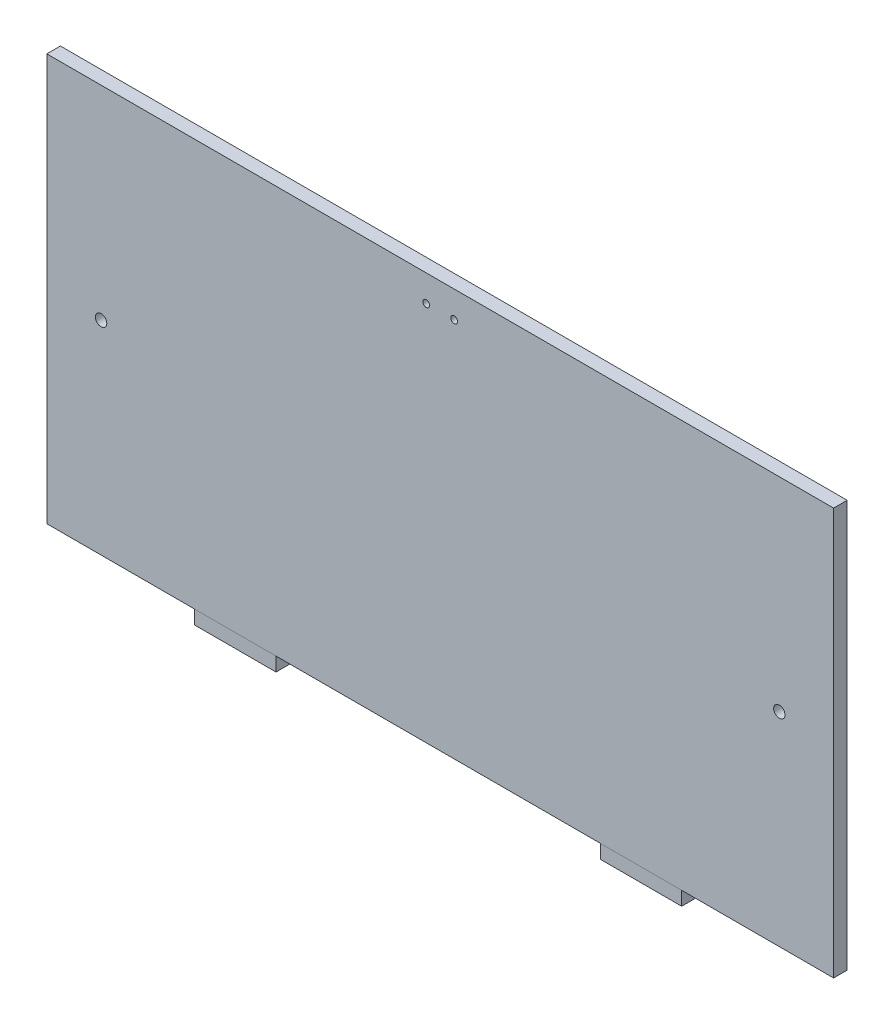
ISO-10303-21;
HEADER;
FILE_DESCRIPTION(('STEP AP214'),'2;1');
FILE_NAME('part.step','',(''),(''),'','','');
FILE_SCHEMA(('AUTOMOTIVE_DESIGN { 1 0 10303 214 1 1 1 1 }'));
ENDSEC;
DATA;
#1=APPLICATION_CONTEXT('core data for automotive mechanical design processes');
#2=APPLICATION_PROTOCOL_DEFINITION('international standard','automotive_design',2000,#1);
#3=PRODUCT_CONTEXT('',#1,'mechanical');
#4=PRODUCT('Part','Part','',(#3));
#5=PRODUCT_RELATED_PRODUCT_CATEGORY('part','',(#4));
#6=PRODUCT_DEFINITION_FORMATION('','',#4);
#7=PRODUCT_DEFINITION_CONTEXT('part definition',#1,'design');
#8=PRODUCT_DEFINITION('design','',#6,#7);
#9=PRODUCT_DEFINITION_SHAPE('','',#8);
#10=(LENGTH_UNIT() NAMED_UNIT(*) SI_UNIT(.MILLI.,.METRE.));
#11=(NAMED_UNIT(*) PLANE_ANGLE_UNIT() SI_UNIT($,.RADIAN.));
#12=(NAMED_UNIT(*) SI_UNIT($,.STERADIAN.) SOLID_ANGLE_UNIT());
#13=UNCERTAINTY_MEASURE_WITH_UNIT(LENGTH_MEASURE(1.E-05),#10,'distance_accuracy_value','');
#14=(GEOMETRIC_REPRESENTATION_CONTEXT(3) GLOBAL_UNCERTAINTY_ASSIGNED_CONTEXT((#13)) GLOBAL_UNIT_ASSIGNED_CONTEXT((#10,
#11,#12)) REPRESENTATION_CONTEXT('',''));
#15=CARTESIAN_POINT('',(0.,0.,0.));
#16=DIRECTION('',(0.,0.,1.));
#17=DIRECTION('',(1.,0.,0.));
#18=AXIS2_PLACEMENT_3D('',#15,#16,#17);
#19=CARTESIAN_POINT('',(0.,0.,5.));
#20=DIRECTION('',(0.,0.,1.));
#21=DIRECTION('',(1.,0.,0.));
#22=AXIS2_PLACEMENT_3D('',#19,#20,#21);
#23=PLANE('',#22);
#24=DIRECTION('',(1.,0.,0.));
#25=VECTOR('',#24,1.);
#26=CARTESIAN_POINT('',(0.,-80.1,5.));
#27=LINE('',#26,#25);
#28=CARTESIAN_POINT('',(-90.52,-80.1,5.));
#29=VERTEX_POINT('',#28);
#30=CARTESIAN_POINT('',(-60.52,-80.1,5.));
#31=VERTEX_POINT('',#30);
#32=EDGE_CURVE('E160',#29,#31,#27,.T.);
#33=ORIENTED_EDGE('',*,*,#32,.T.);
#34=DIRECTION('',(0.,-1.,0.));
#35=VECTOR('',#34,1.);
#36=CARTESIAN_POINT('',(-60.52,-69.9,5.));
#37=LINE('',#36,#35);
#38=CARTESIAN_POINT('',(-60.52,-69.9,5.));
#39=VERTEX_POINT('',#38);
#40=EDGE_CURVE('E112',#39,#31,#37,.T.);
#41=ORIENTED_EDGE('',*,*,#40,.F.);
#42=DIRECTION('',(1.,0.,0.));
#43=VECTOR('',#42,1.);
#44=CARTESIAN_POINT('',(-90.52,-69.9,5.));
#45=LINE('',#44,#43);
#46=CARTESIAN_POINT('',(-90.52,-69.9,5.));
#47=VERTEX_POINT('',#46);
#48=EDGE_CURVE('E13',#47,#39,#45,.T.);
#49=ORIENTED_EDGE('',*,*,#48,.F.);
#50=DIRECTION('',(0.,-1.,0.));
#51=VECTOR('',#50,1.);
#52=CARTESIAN_POINT('',(-90.52,-69.9,5.));
#53=LINE('',#52,#51);
#54=EDGE_CURVE('E176',#47,#29,#53,.T.);
#55=ORIENTED_EDGE('',*,*,#54,.T.);
#56=EDGE_LOOP('',(#33,#41,#49,#55));
#57=FACE_BOUND('',#56,.T.);
#58=ADVANCED_FACE('F101',(#57),#23,.T.);
#59=CARTESIAN_POINT('',(-60.52,0.,0.));
#60=DIRECTION('',(-1.,0.,0.));
#61=DIRECTION('',(0.,0.,1.));
#62=AXIS2_PLACEMENT_3D('',#59,#60,#61);
#63=PLANE('',#62);
#64=ORIENTED_EDGE('',*,*,#40,.T.);
#65=DIRECTION('',(0.,0.,1.));
#66=VECTOR('',#65,1.);
#67=CARTESIAN_POINT('',(-60.52,-80.1,0.));
#68=LINE('',#67,#66);
#69=CARTESIAN_POINT('',(-60.52,-80.1,0.));
#70=VERTEX_POINT('',#69);
#71=EDGE_CURVE('E162',#70,#31,#68,.T.);
#72=ORIENTED_EDGE('',*,*,#71,.F.);
#73=DIRECTION('',(0.,-1.,0.));
#74=VECTOR('',#73,1.);
#75=CARTESIAN_POINT('',(-60.52,-69.9,0.));
#76=LINE('',#75,#74);
#77=CARTESIAN_POINT('',(-60.52,-69.9,0.));
#78=VERTEX_POINT('',#77);
#79=EDGE_CURVE('E140',#78,#70,#76,.T.);
#80=ORIENTED_EDGE('',*,*,#79,.F.);
#81=DIRECTION('',(0.,0.,1.));
#82=VECTOR('',#81,1.);
#83=CARTESIAN_POINT('',(-60.52,-69.9,0.));
#84=LINE('',#83,#82);
#85=EDGE_CURVE('E168',#78,#39,#84,.T.);
#86=ORIENTED_EDGE('',*,*,#85,.T.);
#87=EDGE_LOOP('',(#64,#72,#80,#86));
#88=FACE_BOUND('',#87,.T.);
#89=ADVANCED_FACE('F187',(#88),#63,.F.);
#90=CARTESIAN_POINT('',(-90.52,0.,0.));
#91=DIRECTION('',(-1.,0.,0.));
#92=DIRECTION('',(0.,0.,1.));
#93=AXIS2_PLACEMENT_3D('',#90,#91,#92);
#94=PLANE('',#93);
#95=DIRECTION('',(0.,0.,1.));
#96=VECTOR('',#95,1.);
#97=CARTESIAN_POINT('',(-90.52,-80.1,0.));
#98=LINE('',#97,#96);
#99=CARTESIAN_POINT('',(-90.52,-80.1,0.));
#100=VERTEX_POINT('',#99);
#101=EDGE_CURVE('E150',#100,#29,#98,.T.);
#102=ORIENTED_EDGE('',*,*,#101,.T.);
#103=ORIENTED_EDGE('',*,*,#54,.F.);
#104=DIRECTION('',(0.,0.,1.));
#105=VECTOR('',#104,1.);
#106=CARTESIAN_POINT('',(-90.52,-69.9,0.));
#107=LINE('',#106,#105);
#108=CARTESIAN_POINT('',(-90.52,-69.9,0.));
#109=VERTEX_POINT('',#108);
#110=EDGE_CURVE('E152',#109,#47,#107,.T.);
#111=ORIENTED_EDGE('',*,*,#110,.F.);
#112=DIRECTION('',(0.,-1.,0.));
#113=VECTOR('',#112,1.);
#114=CARTESIAN_POINT('',(-90.52,-69.9,0.));
#115=LINE('',#114,#113);
#116=EDGE_CURVE('E146',#109,#100,#115,.T.);
#117=ORIENTED_EDGE('',*,*,#116,.T.);
#118=EDGE_LOOP('',(#102,#103,#111,#117));
#119=FACE_BOUND('',#118,.T.);
#120=ADVANCED_FACE('F148',(#119),#94,.T.);
#121=CARTESIAN_POINT('',(0.,-80.1,0.));
#122=DIRECTION('',(0.,-1.,0.));
#123=DIRECTION('',(0.,0.,-1.));
#124=AXIS2_PLACEMENT_3D('',#121,#122,#123);
#125=PLANE('',#124);
#126=ORIENTED_EDGE('',*,*,#32,.F.);
#127=ORIENTED_EDGE('',*,*,#101,.F.);
#128=DIRECTION('',(1.,0.,0.));
#129=VECTOR('',#128,1.);
#130=CARTESIAN_POINT('',(0.,-80.1,0.));
#131=LINE('',#130,#129);
#132=EDGE_CURVE('E105',#100,#70,#131,.T.);
#133=ORIENTED_EDGE('',*,*,#132,.T.);
#134=ORIENTED_EDGE('',*,*,#71,.T.);
#135=EDGE_LOOP('',(#126,#127,#133,#134));
#136=FACE_BOUND('',#135,.T.);
#137=ADVANCED_FACE('F158',(#136),#125,.T.);
#138=CARTESIAN_POINT('',(0.,0.,0.));
#139=DIRECTION('',(0.,0.,1.));
#140=DIRECTION('',(1.,0.,0.));
#141=AXIS2_PLACEMENT_3D('',#138,#139,#140);
#142=PLANE('',#141);
#143=ORIENTED_EDGE('',*,*,#79,.T.);
#144=ORIENTED_EDGE('',*,*,#132,.F.);
#145=ORIENTED_EDGE('',*,*,#116,.F.);
#146=DIRECTION('',(1.,0.,0.));
#147=VECTOR('',#146,1.);
#148=CARTESIAN_POINT('',(-90.52,-69.9,0.));
#149=LINE('',#148,#147);
#150=EDGE_CURVE('E173',#109,#78,#149,.T.);
#151=ORIENTED_EDGE('',*,*,#150,.T.);
#152=EDGE_LOOP('',(#143,#144,#145,#151));
#153=FACE_BOUND('',#152,.T.);
#154=ADVANCED_FACE('F103',(#153),#142,.F.);
#155=CARTESIAN_POINT('',(-90.52,-69.9,0.));
#156=DIRECTION('',(0.,-1.,0.));
#157=DIRECTION('',(0.,0.,-1.));
#158=AXIS2_PLACEMENT_3D('',#155,#156,#157);
#159=PLANE('',#158);
#160=ORIENTED_EDGE('',*,*,#48,.T.);
#161=ORIENTED_EDGE('',*,*,#85,.F.);
#162=ORIENTED_EDGE('',*,*,#150,.F.);
#163=ORIENTED_EDGE('',*,*,#110,.T.);
#164=EDGE_LOOP('',(#160,#161,#162,#163));
#165=FACE_BOUND('',#164,.T.);
#166=ADVANCED_FACE('F184',(#165),#159,.F.);
#167=CLOSED_SHELL('',(#58,#89,#120,#137,#154,#166));
#168=MANIFOLD_SOLID_BREP('B2',#167);
#169=CARTESIAN_POINT('',(0.,0.,5.));
#170=DIRECTION('',(0.,0.,1.));
#171=DIRECTION('',(1.,0.,0.));
#172=AXIS2_PLACEMENT_3D('',#169,#170,#171);
#173=PLANE('',#172);
#174=DIRECTION('',(0.,-1.,0.));
#175=VECTOR('',#174,1.);
#176=CARTESIAN_POINT('',(89.,0.,5.));
#177=LINE('',#176,#175);
#178=CARTESIAN_POINT('',(89.,-69.9,5.));
#179=VERTEX_POINT('',#178);
#180=CARTESIAN_POINT('',(89.,-80.1,5.));
#181=VERTEX_POINT('',#180);
#182=EDGE_CURVE('E306',#179,#181,#177,.T.);
#183=ORIENTED_EDGE('',*,*,#182,.F.);
#184=DIRECTION('',(1.,0.,0.));
#185=VECTOR('',#184,1.);
#186=CARTESIAN_POINT('',(59.,-69.9,5.));
#187=LINE('',#186,#185);
#188=CARTESIAN_POINT('',(59.,-69.9,5.));
#189=VERTEX_POINT('',#188);
#190=EDGE_CURVE('E325',#189,#179,#187,.T.);
#191=ORIENTED_EDGE('',*,*,#190,.F.);
#192=DIRECTION('',(0.,-1.,0.));
#193=VECTOR('',#192,1.);
#194=CARTESIAN_POINT('',(59.,0.,5.));
#195=LINE('',#194,#193);
#196=CARTESIAN_POINT('',(59.,-80.1,5.));
#197=VERTEX_POINT('',#196);
#198=EDGE_CURVE('E312',#189,#197,#195,.T.);
#199=ORIENTED_EDGE('',*,*,#198,.T.);
#200=DIRECTION('',(1.,0.,0.));
#201=VECTOR('',#200,1.);
#202=CARTESIAN_POINT('',(0.,-80.1,5.));
#203=LINE('',#202,#201);
#204=EDGE_CURVE('E320',#197,#181,#203,.T.);
#205=ORIENTED_EDGE('',*,*,#204,.T.);
#206=EDGE_LOOP('',(#183,#191,#199,#205));
#207=FACE_BOUND('',#206,.T.);
#208=ADVANCED_FACE('F266',(#207),#173,.T.);
#209=CARTESIAN_POINT('',(89.,0.,0.));
#210=DIRECTION('',(-1.,0.,0.));
#211=DIRECTION('',(0.,0.,1.));
#212=AXIS2_PLACEMENT_3D('',#209,#210,#211);
#213=PLANE('',#212);
#214=ORIENTED_EDGE('',*,*,#182,.T.);
#215=DIRECTION('',(0.,0.,1.));
#216=VECTOR('',#215,1.);
#217=CARTESIAN_POINT('',(89.,-80.1,0.));
#218=LINE('',#217,#216);
#219=CARTESIAN_POINT('',(89.,-80.1,0.));
#220=VERTEX_POINT('',#219);
#221=EDGE_CURVE('E99',#220,#181,#218,.T.);
#222=ORIENTED_EDGE('',*,*,#221,.F.);
#223=DIRECTION('',(0.,-1.,0.));
#224=VECTOR('',#223,1.);
#225=CARTESIAN_POINT('',(89.,0.,0.));
#226=LINE('',#225,#224);
#227=CARTESIAN_POINT('',(89.,-69.9,0.));
#228=VERTEX_POINT('',#227);
#229=EDGE_CURVE('E286',#228,#220,#226,.T.);
#230=ORIENTED_EDGE('',*,*,#229,.F.);
#231=DIRECTION('',(0.,0.,1.));
#232=VECTOR('',#231,1.);
#233=CARTESIAN_POINT('',(89.,-69.9,0.));
#234=LINE('',#233,#232);
#235=EDGE_CURVE('E270',#228,#179,#234,.T.);
#236=ORIENTED_EDGE('',*,*,#235,.T.);
#237=EDGE_LOOP('',(#214,#222,#230,#236));
#238=FACE_BOUND('',#237,.T.);
#239=ADVANCED_FACE('F349',(#238),#213,.F.);
#240=CARTESIAN_POINT('',(59.,0.,0.));
#241=DIRECTION('',(-1.,0.,0.));
#242=DIRECTION('',(0.,0.,1.));
#243=AXIS2_PLACEMENT_3D('',#240,#241,#242);
#244=PLANE('',#243);
#245=ORIENTED_EDGE('',*,*,#198,.F.);
#246=DIRECTION('',(0.,0.,1.));
#247=VECTOR('',#246,1.);
#248=CARTESIAN_POINT('',(59.,-69.9,0.));
#249=LINE('',#248,#247);
#250=CARTESIAN_POINT('',(59.,-69.9,0.));
#251=VERTEX_POINT('',#250);
#252=EDGE_CURVE('E316',#251,#189,#249,.T.);
#253=ORIENTED_EDGE('',*,*,#252,.F.);
#254=DIRECTION('',(0.,-1.,0.));
#255=VECTOR('',#254,1.);
#256=CARTESIAN_POINT('',(59.,0.,0.));
#257=LINE('',#256,#255);
#258=CARTESIAN_POINT('',(59.,-80.1,0.));
#259=VERTEX_POINT('',#258);
#260=EDGE_CURVE('E344',#251,#259,#257,.T.);
#261=ORIENTED_EDGE('',*,*,#260,.T.);
#262=DIRECTION('',(0.,0.,1.));
#263=VECTOR('',#262,1.);
#264=CARTESIAN_POINT('',(59.,-80.1,0.));
#265=LINE('',#264,#263);
#266=EDGE_CURVE('E277',#259,#197,#265,.T.);
#267=ORIENTED_EDGE('',*,*,#266,.T.);
#268=EDGE_LOOP('',(#245,#253,#261,#267));
#269=FACE_BOUND('',#268,.T.);
#270=ADVANCED_FACE('F314',(#269),#244,.T.);
#271=CARTESIAN_POINT('',(0.,-80.1,0.));
#272=DIRECTION('',(0.,-1.,0.));
#273=DIRECTION('',(0.,0.,-1.));
#274=AXIS2_PLACEMENT_3D('',#271,#272,#273);
#275=PLANE('',#274);
#276=ORIENTED_EDGE('',*,*,#204,.F.);
#277=ORIENTED_EDGE('',*,*,#266,.F.);
#278=DIRECTION('',(1.,0.,0.));
#279=VECTOR('',#278,1.);
#280=CARTESIAN_POINT('',(0.,-80.1,0.));
#281=LINE('',#280,#279);
#282=EDGE_CURVE('E335',#259,#220,#281,.T.);
#283=ORIENTED_EDGE('',*,*,#282,.T.);
#284=ORIENTED_EDGE('',*,*,#221,.T.);
#285=EDGE_LOOP('',(#276,#277,#283,#284));
#286=FACE_BOUND('',#285,.T.);
#287=ADVANCED_FACE('F352',(#286),#275,.T.);
#288=CARTESIAN_POINT('',(0.,0.,0.));
#289=DIRECTION('',(0.,0.,1.));
#290=DIRECTION('',(1.,0.,0.));
#291=AXIS2_PLACEMENT_3D('',#288,#289,#290);
#292=PLANE('',#291);
#293=ORIENTED_EDGE('',*,*,#229,.T.);
#294=ORIENTED_EDGE('',*,*,#282,.F.);
#295=ORIENTED_EDGE('',*,*,#260,.F.);
#296=DIRECTION('',(1.,0.,0.));
#297=VECTOR('',#296,1.);
#298=CARTESIAN_POINT('',(59.,-69.9,0.));
#299=LINE('',#298,#297);
#300=EDGE_CURVE('E326',#251,#228,#299,.T.);
#301=ORIENTED_EDGE('',*,*,#300,.T.);
#302=EDGE_LOOP('',(#293,#294,#295,#301));
#303=FACE_BOUND('',#302,.T.);
#304=ADVANCED_FACE('F350',(#303),#292,.F.);
#305=CARTESIAN_POINT('',(59.,-69.9,0.));
#306=DIRECTION('',(0.,-1.,0.));
#307=DIRECTION('',(0.,0.,-1.));
#308=AXIS2_PLACEMENT_3D('',#305,#306,#307);
#309=PLANE('',#308);
#310=ORIENTED_EDGE('',*,*,#190,.T.);
#311=ORIENTED_EDGE('',*,*,#235,.F.);
#312=ORIENTED_EDGE('',*,*,#300,.F.);
#313=ORIENTED_EDGE('',*,*,#252,.T.);
#314=EDGE_LOOP('',(#310,#311,#312,#313));
#315=FACE_BOUND('',#314,.T.);
#316=ADVANCED_FACE('F268',(#315),#309,.F.);
#317=CLOSED_SHELL('',(#208,#239,#270,#287,#304,#316));
#318=MANIFOLD_SOLID_BREP('B7',#317);
#319=CARTESIAN_POINT('',(145.,75.,5.));
#320=DIRECTION('',(-1.,0.,0.));
#321=DIRECTION('',(0.,-1.,0.));
#322=AXIS2_PLACEMENT_3D('',#319,#320,#321);
#323=PLANE('',#322);
#324=DIRECTION('',(0.,1.,0.));
#325=VECTOR('',#324,1.);
#326=CARTESIAN_POINT('',(145.,75.,0.));
#327=LINE('',#326,#325);
#328=CARTESIAN_POINT('',(145.,-75.,0.));
#329=VERTEX_POINT('',#328);
#330=CARTESIAN_POINT('',(145.,75.,0.));
#331=VERTEX_POINT('',#330);
#332=EDGE_CURVE('E491',#329,#331,#327,.T.);
#333=ORIENTED_EDGE('',*,*,#332,.T.);
#334=DIRECTION('',(0.,0.,-1.));
#335=VECTOR('',#334,1.);
#336=CARTESIAN_POINT('',(145.,75.,5.));
#337=LINE('',#336,#335);
#338=CARTESIAN_POINT('',(145.,75.,5.));
#339=VERTEX_POINT('',#338);
#340=EDGE_CURVE('E264',#339,#331,#337,.T.);
#341=ORIENTED_EDGE('',*,*,#340,.F.);
#342=DIRECTION('',(0.,1.,0.));
#343=VECTOR('',#342,1.);
#344=CARTESIAN_POINT('',(145.,75.,5.));
#345=LINE('',#344,#343);
#346=CARTESIAN_POINT('',(145.,-75.,5.));
#347=VERTEX_POINT('',#346);
#348=EDGE_CURVE('E474',#347,#339,#345,.T.);
#349=ORIENTED_EDGE('',*,*,#348,.F.);
#350=DIRECTION('',(0.,0.,-1.));
#351=VECTOR('',#350,1.);
#352=CARTESIAN_POINT('',(145.,-75.,5.));
#353=LINE('',#352,#351);
#354=EDGE_CURVE('E487',#347,#329,#353,.T.);
#355=ORIENTED_EDGE('',*,*,#354,.T.);
#356=EDGE_LOOP('',(#333,#341,#349,#355));
#357=FACE_BOUND('',#356,.T.);
#358=ADVANCED_FACE('F422',(#357),#323,.F.);
#359=CARTESIAN_POINT('',(-145.,75.,5.));
#360=DIRECTION('',(0.,-1.,0.));
#361=DIRECTION('',(0.,0.,-1.));
#362=AXIS2_PLACEMENT_3D('',#359,#360,#361);
#363=PLANE('',#362);
#364=DIRECTION('',(-1.,0.,0.));
#365=VECTOR('',#364,1.);
#366=CARTESIAN_POINT('',(-145.,75.,0.));
#367=LINE('',#366,#365);
#368=CARTESIAN_POINT('',(-145.,75.,0.));
#369=VERTEX_POINT('',#368);
#370=EDGE_CURVE('E479',#331,#369,#367,.T.);
#371=ORIENTED_EDGE('',*,*,#370,.T.);
#372=DIRECTION('',(0.,0.,-1.));
#373=VECTOR('',#372,1.);
#374=CARTESIAN_POINT('',(-145.,75.,5.));
#375=LINE('',#374,#373);
#376=CARTESIAN_POINT('',(-145.,75.,5.));
#377=VERTEX_POINT('',#376);
#378=EDGE_CURVE('E431',#377,#369,#375,.T.);
#379=ORIENTED_EDGE('',*,*,#378,.F.);
#380=DIRECTION('',(-1.,0.,0.));
#381=VECTOR('',#380,1.);
#382=CARTESIAN_POINT('',(-145.,75.,5.));
#383=LINE('',#382,#381);
#384=EDGE_CURVE('E469',#339,#377,#383,.T.);
#385=ORIENTED_EDGE('',*,*,#384,.F.);
#386=ORIENTED_EDGE('',*,*,#340,.T.);
#387=EDGE_LOOP('',(#371,#379,#385,#386));
#388=FACE_BOUND('',#387,.T.);
#389=ADVANCED_FACE('F478',(#388),#363,.F.);
#390=CARTESIAN_POINT('',(-145.,75.,5.));
#391=DIRECTION('',(1.,0.,0.));
#392=DIRECTION('',(0.,1.,0.));
#393=AXIS2_PLACEMENT_3D('',#390,#391,#392);
#394=PLANE('',#393);
#395=DIRECTION('',(0.,-1.,0.));
#396=VECTOR('',#395,1.);
#397=CARTESIAN_POINT('',(-145.,75.,0.));
#398=LINE('',#397,#396);
#399=CARTESIAN_POINT('',(-145.,-75.,0.));
#400=VERTEX_POINT('',#399);
#401=EDGE_CURVE('E456',#369,#400,#398,.T.);
#402=ORIENTED_EDGE('',*,*,#401,.T.);
#403=DIRECTION('',(0.,0.,-1.));
#404=VECTOR('',#403,1.);
#405=CARTESIAN_POINT('',(-145.,-75.,5.));
#406=LINE('',#405,#404);
#407=CARTESIAN_POINT('',(-145.,-75.,5.));
#408=VERTEX_POINT('',#407);
#409=EDGE_CURVE('E481',#408,#400,#406,.T.);
#410=ORIENTED_EDGE('',*,*,#409,.F.);
#411=DIRECTION('',(0.,-1.,0.));
#412=VECTOR('',#411,1.);
#413=CARTESIAN_POINT('',(-145.,75.,5.));
#414=LINE('',#413,#412);
#415=EDGE_CURVE('E472',#377,#408,#414,.T.);
#416=ORIENTED_EDGE('',*,*,#415,.F.);
#417=ORIENTED_EDGE('',*,*,#378,.T.);
#418=EDGE_LOOP('',(#402,#410,#416,#417));
#419=FACE_BOUND('',#418,.T.);
#420=ADVANCED_FACE('F482',(#419),#394,.F.);
#421=CARTESIAN_POINT('',(-145.,-75.,5.));
#422=DIRECTION('',(0.,1.,0.));
#423=DIRECTION('',(0.,0.,1.));
#424=AXIS2_PLACEMENT_3D('',#421,#422,#423);
#425=PLANE('',#424);
#426=DIRECTION('',(1.,0.,0.));
#427=VECTOR('',#426,1.);
#428=CARTESIAN_POINT('',(-145.,-75.,0.));
#429=LINE('',#428,#427);
#430=EDGE_CURVE('E462',#400,#329,#429,.T.);
#431=ORIENTED_EDGE('',*,*,#430,.T.);
#432=ORIENTED_EDGE('',*,*,#354,.F.);
#433=DIRECTION('',(1.,0.,0.));
#434=VECTOR('',#433,1.);
#435=CARTESIAN_POINT('',(-145.,-75.,5.));
#436=LINE('',#435,#434);
#437=EDGE_CURVE('E439',#408,#347,#436,.T.);
#438=ORIENTED_EDGE('',*,*,#437,.F.);
#439=ORIENTED_EDGE('',*,*,#409,.T.);
#440=EDGE_LOOP('',(#431,#432,#438,#439));
#441=FACE_BOUND('',#440,.T.);
#442=ADVANCED_FACE('F506',(#441),#425,.F.);
#443=CARTESIAN_POINT('',(0.,0.,5.));
#444=DIRECTION('',(0.,0.,1.));
#445=DIRECTION('',(1.,0.,0.));
#446=AXIS2_PLACEMENT_3D('',#443,#444,#445);
#447=PLANE('',#446);
#448=CARTESIAN_POINT('',(125.,0.,5.));
#449=DIRECTION('',(0.,0.,1.));
#450=DIRECTION('',(1.,0.,0.));
#451=AXIS2_PLACEMENT_3D('',#448,#449,#450);
#452=CIRCLE('',#451,2.1);
#453=CARTESIAN_POINT('',(127.1,0.,5.));
#454=VERTEX_POINT('',#453);
#455=EDGE_CURVE('E519',#454,#454,#452,.T.);
#456=ORIENTED_EDGE('',*,*,#455,.F.);
#457=EDGE_LOOP('',(#456));
#458=FACE_BOUND('',#457,.T.);
#459=CARTESIAN_POINT('',(-125.,0.,5.));
#460=DIRECTION('',(0.,0.,1.));
#461=DIRECTION('',(1.,0.,0.));
#462=AXIS2_PLACEMENT_3D('',#459,#460,#461);
#463=CIRCLE('',#462,2.1);
#464=CARTESIAN_POINT('',(-122.9,0.,5.));
#465=VERTEX_POINT('',#464);
#466=EDGE_CURVE('E532',#465,#465,#463,.T.);
#467=ORIENTED_EDGE('',*,*,#466,.F.);
#468=EDGE_LOOP('',(#467));
#469=FACE_BOUND('',#468,.T.);
#470=CARTESIAN_POINT('',(-5.15000000000003,65.2,5.));
#471=DIRECTION('',(0.,0.,1.));
#472=DIRECTION('',(1.,0.,0.));
#473=AXIS2_PLACEMENT_3D('',#470,#471,#472);
#474=CIRCLE('',#473,1.25);
#475=CARTESIAN_POINT('',(-3.90000000000003,65.2,5.));
#476=VERTEX_POINT('',#475);
#477=EDGE_CURVE('E523',#476,#476,#474,.T.);
#478=ORIENTED_EDGE('',*,*,#477,.F.);
#479=EDGE_LOOP('',(#478));
#480=FACE_BOUND('',#479,.T.);
#481=CARTESIAN_POINT('',(5.14999999999997,65.2,5.));
#482=DIRECTION('',(0.,0.,1.));
#483=DIRECTION('',(1.,0.,0.));
#484=AXIS2_PLACEMENT_3D('',#481,#482,#483);
#485=CIRCLE('',#484,1.25);
#486=CARTESIAN_POINT('',(6.39999999999997,65.2,5.));
#487=VERTEX_POINT('',#486);
#488=EDGE_CURVE('E514',#487,#487,#485,.T.);
#489=ORIENTED_EDGE('',*,*,#488,.F.);
#490=EDGE_LOOP('',(#489));
#491=FACE_BOUND('',#490,.T.);
#492=ORIENTED_EDGE('',*,*,#348,.T.);
#493=ORIENTED_EDGE('',*,*,#384,.T.);
#494=ORIENTED_EDGE('',*,*,#415,.T.);
#495=ORIENTED_EDGE('',*,*,#437,.T.);
#496=EDGE_LOOP('',(#492,#493,#494,#495));
#497=FACE_BOUND('',#496,.T.);
#498=ADVANCED_FACE('F470',(#458,#469,#480,#491,#497),#447,.T.);
#499=CARTESIAN_POINT('',(0.,0.,0.));
#500=DIRECTION('',(0.,0.,1.));
#501=DIRECTION('',(1.,0.,0.));
#502=AXIS2_PLACEMENT_3D('',#499,#500,#501);
#503=PLANE('',#502);
#504=CARTESIAN_POINT('',(125.,0.,0.));
#505=DIRECTION('',(0.,0.,-1.));
#506=DIRECTION('',(-1.,0.,0.));
#507=AXIS2_PLACEMENT_3D('',#504,#505,#506);
#508=CIRCLE('',#507,2.1);
#509=CARTESIAN_POINT('',(122.9,0.,0.));
#510=VERTEX_POINT('',#509);
#511=EDGE_CURVE('E535',#510,#510,#508,.T.);
#512=ORIENTED_EDGE('',*,*,#511,.F.);
#513=EDGE_LOOP('',(#512));
#514=FACE_BOUND('',#513,.T.);
#515=CARTESIAN_POINT('',(-125.,0.,0.));
#516=DIRECTION('',(0.,0.,-1.));
#517=DIRECTION('',(1.,0.,0.));
#518=AXIS2_PLACEMENT_3D('',#515,#516,#517);
#519=CIRCLE('',#518,2.1);
#520=CARTESIAN_POINT('',(-122.9,0.,0.));
#521=VERTEX_POINT('',#520);
#522=EDGE_CURVE('E536',#521,#521,#519,.T.);
#523=ORIENTED_EDGE('',*,*,#522,.F.);
#524=EDGE_LOOP('',(#523));
#525=FACE_BOUND('',#524,.T.);
#526=CARTESIAN_POINT('',(-5.15000000000003,65.2,0.));
#527=DIRECTION('',(0.,0.,1.));
#528=DIRECTION('',(1.,0.,0.));
#529=AXIS2_PLACEMENT_3D('',#526,#527,#528);
#530=CIRCLE('',#529,1.25);
#531=CARTESIAN_POINT('',(-3.90000000000003,65.2,0.));
#532=VERTEX_POINT('',#531);
#533=EDGE_CURVE('E495',#532,#532,#530,.T.);
#534=ORIENTED_EDGE('',*,*,#533,.T.);
#535=EDGE_LOOP('',(#534));
#536=FACE_BOUND('',#535,.T.);
#537=CARTESIAN_POINT('',(5.14999999999997,65.2,0.));
#538=DIRECTION('',(0.,0.,1.));
#539=DIRECTION('',(1.,0.,0.));
#540=AXIS2_PLACEMENT_3D('',#537,#538,#539);
#541=CIRCLE('',#540,1.25);
#542=CARTESIAN_POINT('',(6.39999999999997,65.2,0.));
#543=VERTEX_POINT('',#542);
#544=EDGE_CURVE('E518',#543,#543,#541,.T.);
#545=ORIENTED_EDGE('',*,*,#544,.T.);
#546=EDGE_LOOP('',(#545));
#547=FACE_BOUND('',#546,.T.);
#548=ORIENTED_EDGE('',*,*,#332,.F.);
#549=ORIENTED_EDGE('',*,*,#430,.F.);
#550=ORIENTED_EDGE('',*,*,#401,.F.);
#551=ORIENTED_EDGE('',*,*,#370,.F.);
#552=EDGE_LOOP('',(#548,#549,#550,#551));
#553=FACE_BOUND('',#552,.T.);
#554=ADVANCED_FACE('F509',(#514,#525,#536,#547,#553),#503,.F.);
#555=CARTESIAN_POINT('',(5.14999999999997,65.2,0.));
#556=DIRECTION('',(0.,0.,1.));
#557=DIRECTION('',(1.,0.,0.));
#558=AXIS2_PLACEMENT_3D('',#555,#556,#557);
#559=CYLINDRICAL_SURFACE('',#558,1.25);
#560=ORIENTED_EDGE('',*,*,#544,.F.);
#561=EDGE_LOOP('',(#560));
#562=FACE_BOUND('',#561,.T.);
#563=ORIENTED_EDGE('',*,*,#488,.T.);
#564=EDGE_LOOP('',(#563));
#565=FACE_BOUND('',#564,.T.);
#566=ADVANCED_FACE('F547',(#562,#565),#559,.F.);
#567=CARTESIAN_POINT('',(-5.15000000000003,65.2,0.));
#568=DIRECTION('',(0.,0.,1.));
#569=DIRECTION('',(1.,0.,0.));
#570=AXIS2_PLACEMENT_3D('',#567,#568,#569);
#571=CYLINDRICAL_SURFACE('',#570,1.25);
#572=ORIENTED_EDGE('',*,*,#533,.F.);
#573=EDGE_LOOP('',(#572));
#574=FACE_BOUND('',#573,.T.);
#575=ORIENTED_EDGE('',*,*,#477,.T.);
#576=EDGE_LOOP('',(#575));
#577=FACE_BOUND('',#576,.T.);
#578=ADVANCED_FACE('F557',(#574,#577),#571,.F.);
#579=CARTESIAN_POINT('',(-125.,0.,10.));
#580=DIRECTION('',(0.,0.,-1.));
#581=DIRECTION('',(-1.,0.,0.));
#582=AXIS2_PLACEMENT_3D('',#579,#580,#581);
#583=CYLINDRICAL_SURFACE('',#582,2.1);
#584=ORIENTED_EDGE('',*,*,#466,.T.);
#585=EDGE_LOOP('',(#584));
#586=FACE_BOUND('',#585,.T.);
#587=ORIENTED_EDGE('',*,*,#522,.T.);
#588=EDGE_LOOP('',(#587));
#589=FACE_BOUND('',#588,.T.);
#590=ADVANCED_FACE('F604',(#586,#589),#583,.F.);
#591=CARTESIAN_POINT('',(125.,0.,10.));
#592=DIRECTION('',(0.,0.,-1.));
#593=DIRECTION('',(-1.,0.,0.));
#594=AXIS2_PLACEMENT_3D('',#591,#592,#593);
#595=CYLINDRICAL_SURFACE('',#594,2.1);
#596=ORIENTED_EDGE('',*,*,#455,.T.);
#597=EDGE_LOOP('',(#596));
#598=FACE_BOUND('',#597,.T.);
#599=ORIENTED_EDGE('',*,*,#511,.T.);
#600=EDGE_LOOP('',(#599));
#601=FACE_BOUND('',#600,.T.);
#602=ADVANCED_FACE('F543',(#598,#601),#595,.F.);
#603=CLOSED_SHELL('',(#358,#389,#420,#442,#498,#554,#566,#578,#590,#602));
#604=MANIFOLD_SOLID_BREP('B93',#603);
#605=ADVANCED_BREP_SHAPE_REPRESENTATION('',(#18,#168,#318,#604),#14);
#606=SHAPE_DEFINITION_REPRESENTATION(#9,#605);
ENDSEC;
END-ISO-10303-21;
